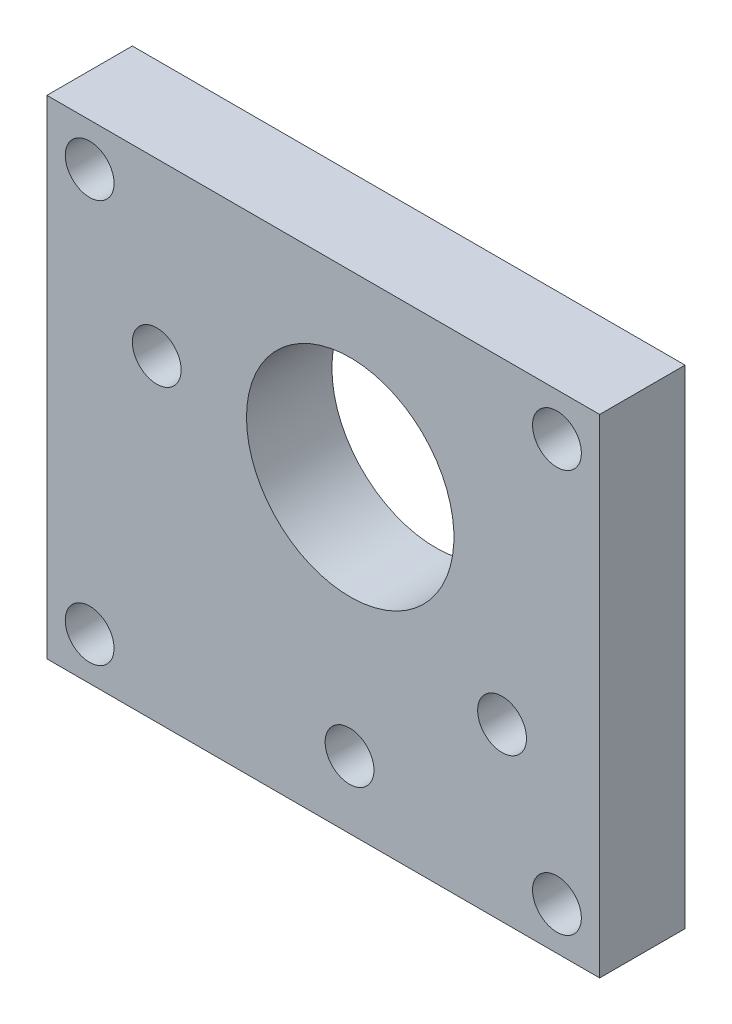
ISO-10303-21;
HEADER;
FILE_DESCRIPTION(('STEP AP214'),'2;1');
FILE_NAME('part.step','',(''),(''),'','','');
FILE_SCHEMA(('AUTOMOTIVE_DESIGN { 1 0 10303 214 1 1 1 1 }'));
ENDSEC;
DATA;
#1=APPLICATION_CONTEXT('core data for automotive mechanical design processes');
#2=APPLICATION_PROTOCOL_DEFINITION('international standard','automotive_design',2000,#1);
#3=PRODUCT_CONTEXT('',#1,'mechanical');
#4=PRODUCT('Part','Part','',(#3));
#5=PRODUCT_RELATED_PRODUCT_CATEGORY('part','',(#4));
#6=PRODUCT_DEFINITION_FORMATION('','',#4);
#7=PRODUCT_DEFINITION_CONTEXT('part definition',#1,'design');
#8=PRODUCT_DEFINITION('design','',#6,#7);
#9=PRODUCT_DEFINITION_SHAPE('','',#8);
#10=(LENGTH_UNIT() NAMED_UNIT(*) SI_UNIT(.MILLI.,.METRE.));
#11=(NAMED_UNIT(*) PLANE_ANGLE_UNIT() SI_UNIT($,.RADIAN.));
#12=(NAMED_UNIT(*) SI_UNIT($,.STERADIAN.) SOLID_ANGLE_UNIT());
#13=UNCERTAINTY_MEASURE_WITH_UNIT(LENGTH_MEASURE(1.E-05),#10,'distance_accuracy_value','');
#14=(GEOMETRIC_REPRESENTATION_CONTEXT(3) GLOBAL_UNCERTAINTY_ASSIGNED_CONTEXT((#13)) GLOBAL_UNIT_ASSIGNED_CONTEXT((#10,
#11,#12)) REPRESENTATION_CONTEXT('',''));
#15=CARTESIAN_POINT('',(0.,0.,0.));
#16=DIRECTION('',(0.,0.,1.));
#17=DIRECTION('',(1.,0.,0.));
#18=AXIS2_PLACEMENT_3D('',#15,#16,#17);
#19=CARTESIAN_POINT('',(-19.1726141078838,20.5454356846473,-7.));
#20=DIRECTION('',(-1.,0.,0.));
#21=DIRECTION('',(0.,-1.,0.));
#22=AXIS2_PLACEMENT_3D('',#19,#20,#21);
#23=PLANE('',#22);
#24=DIRECTION('',(0.,-1.,0.));
#25=VECTOR('',#24,1.);
#26=CARTESIAN_POINT('',(-19.1726141078838,20.5454356846473,0.));
#27=LINE('',#26,#25);
#28=CARTESIAN_POINT('',(-19.1726141078838,20.5454356846473,0.));
#29=VERTEX_POINT('',#28);
#30=CARTESIAN_POINT('',(-19.1726141078838,-19.4545643153527,0.));
#31=VERTEX_POINT('',#30);
#32=EDGE_CURVE('E98',#29,#31,#27,.T.);
#33=ORIENTED_EDGE('',*,*,#32,.F.);
#34=DIRECTION('',(0.,0.,1.));
#35=VECTOR('',#34,1.);
#36=CARTESIAN_POINT('',(-19.1726141078838,20.5454356846473,-7.));
#37=LINE('',#36,#35);
#38=CARTESIAN_POINT('',(-19.1726141078838,20.5454356846473,-7.));
#39=VERTEX_POINT('',#38);
#40=EDGE_CURVE('E11',#39,#29,#37,.T.);
#41=ORIENTED_EDGE('',*,*,#40,.F.);
#42=DIRECTION('',(0.,-1.,0.));
#43=VECTOR('',#42,1.);
#44=CARTESIAN_POINT('',(-19.1726141078838,20.5454356846473,-7.));
#45=LINE('',#44,#43);
#46=CARTESIAN_POINT('',(-19.1726141078838,-19.4545643153527,-7.));
#47=VERTEX_POINT('',#46);
#48=EDGE_CURVE('E91',#39,#47,#45,.T.);
#49=ORIENTED_EDGE('',*,*,#48,.T.);
#50=DIRECTION('',(0.,0.,1.));
#51=VECTOR('',#50,1.);
#52=CARTESIAN_POINT('',(-19.1726141078838,-19.4545643153527,-7.));
#53=LINE('',#52,#51);
#54=EDGE_CURVE('E36',#47,#31,#53,.T.);
#55=ORIENTED_EDGE('',*,*,#54,.T.);
#56=EDGE_LOOP('',(#33,#41,#49,#55));
#57=FACE_BOUND('',#56,.T.);
#58=ADVANCED_FACE('F33',(#57),#23,.T.);
#59=CARTESIAN_POINT('',(-19.1726141078838,20.5454356846473,-7.));
#60=DIRECTION('',(0.,1.,0.));
#61=DIRECTION('',(0.,0.,1.));
#62=AXIS2_PLACEMENT_3D('',#59,#60,#61);
#63=PLANE('',#62);
#64=DIRECTION('',(-1.,0.,0.));
#65=VECTOR('',#64,1.);
#66=CARTESIAN_POINT('',(-19.1726141078838,20.5454356846473,0.));
#67=LINE('',#66,#65);
#68=CARTESIAN_POINT('',(26.1273858921162,20.5454356846473,0.));
#69=VERTEX_POINT('',#68);
#70=EDGE_CURVE('E93',#69,#29,#67,.T.);
#71=ORIENTED_EDGE('',*,*,#70,.F.);
#72=DIRECTION('',(0.,0.,1.));
#73=VECTOR('',#72,1.);
#74=CARTESIAN_POINT('',(26.1273858921162,20.5454356846473,-7.));
#75=LINE('',#74,#73);
#76=CARTESIAN_POINT('',(26.1273858921162,20.5454356846473,-7.));
#77=VERTEX_POINT('',#76);
#78=EDGE_CURVE('E42',#77,#69,#75,.T.);
#79=ORIENTED_EDGE('',*,*,#78,.F.);
#80=DIRECTION('',(-1.,0.,0.));
#81=VECTOR('',#80,1.);
#82=CARTESIAN_POINT('',(-19.1726141078838,20.5454356846473,-7.));
#83=LINE('',#82,#81);
#84=EDGE_CURVE('E88',#77,#39,#83,.T.);
#85=ORIENTED_EDGE('',*,*,#84,.T.);
#86=ORIENTED_EDGE('',*,*,#40,.T.);
#87=EDGE_LOOP('',(#71,#79,#85,#86));
#88=FACE_BOUND('',#87,.T.);
#89=ADVANCED_FACE('F109',(#88),#63,.T.);
#90=CARTESIAN_POINT('',(26.1273858921162,20.5454356846473,-7.));
#91=DIRECTION('',(1.,0.,0.));
#92=DIRECTION('',(0.,1.,0.));
#93=AXIS2_PLACEMENT_3D('',#90,#91,#92);
#94=PLANE('',#93);
#95=DIRECTION('',(0.,1.,0.));
#96=VECTOR('',#95,1.);
#97=CARTESIAN_POINT('',(26.1273858921162,20.5454356846473,0.));
#98=LINE('',#97,#96);
#99=CARTESIAN_POINT('',(26.1273858921162,-19.4545643153527,0.));
#100=VERTEX_POINT('',#99);
#101=EDGE_CURVE('E83',#100,#69,#98,.T.);
#102=ORIENTED_EDGE('',*,*,#101,.F.);
#103=DIRECTION('',(0.,0.,1.));
#104=VECTOR('',#103,1.);
#105=CARTESIAN_POINT('',(26.1273858921162,-19.4545643153527,-7.));
#106=LINE('',#105,#104);
#107=CARTESIAN_POINT('',(26.1273858921162,-19.4545643153527,-7.));
#108=VERTEX_POINT('',#107);
#109=EDGE_CURVE('E78',#108,#100,#106,.T.);
#110=ORIENTED_EDGE('',*,*,#109,.F.);
#111=DIRECTION('',(0.,1.,0.));
#112=VECTOR('',#111,1.);
#113=CARTESIAN_POINT('',(26.1273858921162,20.5454356846473,-7.));
#114=LINE('',#113,#112);
#115=EDGE_CURVE('E81',#108,#77,#114,.T.);
#116=ORIENTED_EDGE('',*,*,#115,.T.);
#117=ORIENTED_EDGE('',*,*,#78,.T.);
#118=EDGE_LOOP('',(#102,#110,#116,#117));
#119=FACE_BOUND('',#118,.T.);
#120=ADVANCED_FACE('F80',(#119),#94,.T.);
#121=CARTESIAN_POINT('',(-19.1726141078838,-19.4545643153527,-7.));
#122=DIRECTION('',(0.,-1.,0.));
#123=DIRECTION('',(0.,0.,-1.));
#124=AXIS2_PLACEMENT_3D('',#121,#122,#123);
#125=PLANE('',#124);
#126=DIRECTION('',(1.,0.,0.));
#127=VECTOR('',#126,1.);
#128=CARTESIAN_POINT('',(-19.1726141078838,-19.4545643153527,0.));
#129=LINE('',#128,#127);
#130=EDGE_CURVE('E101',#31,#100,#129,.T.);
#131=ORIENTED_EDGE('',*,*,#130,.F.);
#132=ORIENTED_EDGE('',*,*,#54,.F.);
#133=DIRECTION('',(1.,0.,0.));
#134=VECTOR('',#133,1.);
#135=CARTESIAN_POINT('',(-19.1726141078838,-19.4545643153527,-7.));
#136=LINE('',#135,#134);
#137=EDGE_CURVE('E87',#47,#108,#136,.T.);
#138=ORIENTED_EDGE('',*,*,#137,.T.);
#139=ORIENTED_EDGE('',*,*,#109,.T.);
#140=EDGE_LOOP('',(#131,#132,#138,#139));
#141=FACE_BOUND('',#140,.T.);
#142=ADVANCED_FACE('F90',(#141),#125,.T.);
#143=CARTESIAN_POINT('',(0.,0.,-7.));
#144=DIRECTION('',(0.,0.,1.));
#145=DIRECTION('',(1.,0.,0.));
#146=AXIS2_PLACEMENT_3D('',#143,#144,#145);
#147=PLANE('',#146);
#148=CARTESIAN_POINT('',(5.62738589211616,-13.9545643153527,-7.));
#149=DIRECTION('',(0.,0.,-1.));
#150=DIRECTION('',(-1.,0.,0.));
#151=AXIS2_PLACEMENT_3D('',#148,#149,#150);
#152=CIRCLE('',#151,3.);
#153=CARTESIAN_POINT('',(2.62738589211617,-13.9545643153527,-7.));
#154=VERTEX_POINT('',#153);
#155=EDGE_CURVE('E225',#154,#154,#152,.T.);
#156=ORIENTED_EDGE('',*,*,#155,.F.);
#157=EDGE_LOOP('',(#156));
#158=FACE_BOUND('',#157,.T.);
#159=CARTESIAN_POINT('',(18.1273858921162,-5.4545643153527,-7.));
#160=DIRECTION('',(0.,0.,-1.));
#161=DIRECTION('',(-1.,0.,0.));
#162=AXIS2_PLACEMENT_3D('',#159,#160,#161);
#163=CIRCLE('',#162,3.);
#164=CARTESIAN_POINT('',(15.1273858921162,-5.4545643153527,-7.));
#165=VERTEX_POINT('',#164);
#166=EDGE_CURVE('E235',#165,#165,#163,.T.);
#167=ORIENTED_EDGE('',*,*,#166,.F.);
#168=EDGE_LOOP('',(#167));
#169=FACE_BOUND('',#168,.T.);
#170=CARTESIAN_POINT('',(-10.1726141078838,6.5454356846473,-7.));
#171=DIRECTION('',(0.,0.,-1.));
#172=DIRECTION('',(-1.,0.,0.));
#173=AXIS2_PLACEMENT_3D('',#170,#171,#172);
#174=CIRCLE('',#173,3.);
#175=CARTESIAN_POINT('',(-13.1726141078838,6.5454356846473,-7.));
#176=VERTEX_POINT('',#175);
#177=EDGE_CURVE('E247',#176,#176,#174,.T.);
#178=ORIENTED_EDGE('',*,*,#177,.F.);
#179=EDGE_LOOP('',(#178));
#180=FACE_BOUND('',#179,.T.);
#181=CARTESIAN_POINT('',(5.68295862486169,5.86637990239594,-7.));
#182=DIRECTION('',(0.,0.,-1.));
#183=DIRECTION('',(-1.,0.,0.));
#184=AXIS2_PLACEMENT_3D('',#181,#182,#183);
#185=CIRCLE('',#184,8.5);
#186=CARTESIAN_POINT('',(-2.81704137513832,5.86637990239594,-7.));
#187=VERTEX_POINT('',#186);
#188=EDGE_CURVE('E259',#187,#187,#185,.T.);
#189=ORIENTED_EDGE('',*,*,#188,.F.);
#190=EDGE_LOOP('',(#189));
#191=FACE_BOUND('',#190,.T.);
#192=CARTESIAN_POINT('',(22.6273858921162,17.0454356846473,-7.));
#193=DIRECTION('',(0.,0.,-1.));
#194=DIRECTION('',(-1.,0.,0.));
#195=AXIS2_PLACEMENT_3D('',#192,#193,#194);
#196=CIRCLE('',#195,3.);
#197=CARTESIAN_POINT('',(19.6273858921162,17.0454356846473,-7.));
#198=VERTEX_POINT('',#197);
#199=EDGE_CURVE('E263',#198,#198,#196,.T.);
#200=ORIENTED_EDGE('',*,*,#199,.F.);
#201=EDGE_LOOP('',(#200));
#202=FACE_BOUND('',#201,.T.);
#203=CARTESIAN_POINT('',(-15.6726141078838,17.0454356846473,-7.));
#204=DIRECTION('',(0.,0.,-1.));
#205=DIRECTION('',(-1.,0.,0.));
#206=AXIS2_PLACEMENT_3D('',#203,#204,#205);
#207=CIRCLE('',#206,3.);
#208=CARTESIAN_POINT('',(-18.6726141078838,17.0454356846473,-7.));
#209=VERTEX_POINT('',#208);
#210=EDGE_CURVE('E277',#209,#209,#207,.T.);
#211=ORIENTED_EDGE('',*,*,#210,.F.);
#212=EDGE_LOOP('',(#211));
#213=FACE_BOUND('',#212,.T.);
#214=CARTESIAN_POINT('',(-15.6726141078838,-15.9545643153527,-7.));
#215=DIRECTION('',(0.,0.,-1.));
#216=DIRECTION('',(-1.,0.,0.));
#217=AXIS2_PLACEMENT_3D('',#214,#215,#216);
#218=CIRCLE('',#217,3.);
#219=CARTESIAN_POINT('',(-18.6726141078838,-15.9545643153527,-7.));
#220=VERTEX_POINT('',#219);
#221=EDGE_CURVE('E289',#220,#220,#218,.T.);
#222=ORIENTED_EDGE('',*,*,#221,.F.);
#223=EDGE_LOOP('',(#222));
#224=FACE_BOUND('',#223,.T.);
#225=CARTESIAN_POINT('',(22.6273858921162,-15.9545643153527,-7.));
#226=DIRECTION('',(0.,0.,-1.));
#227=DIRECTION('',(-1.,0.,0.));
#228=AXIS2_PLACEMENT_3D('',#225,#226,#227);
#229=CIRCLE('',#228,3.);
#230=CARTESIAN_POINT('',(19.6273858921162,-15.9545643153527,-7.));
#231=VERTEX_POINT('',#230);
#232=EDGE_CURVE('E301',#231,#231,#229,.T.);
#233=ORIENTED_EDGE('',*,*,#232,.F.);
#234=EDGE_LOOP('',(#233));
#235=FACE_BOUND('',#234,.T.);
#236=ORIENTED_EDGE('',*,*,#48,.F.);
#237=ORIENTED_EDGE('',*,*,#84,.F.);
#238=ORIENTED_EDGE('',*,*,#115,.F.);
#239=ORIENTED_EDGE('',*,*,#137,.F.);
#240=EDGE_LOOP('',(#236,#237,#238,#239));
#241=FACE_BOUND('',#240,.T.);
#242=ADVANCED_FACE('F86',(#158,#169,#180,#191,#202,#213,#224,#235,#241),#147,.F.);
#243=CARTESIAN_POINT('',(0.,0.,0.));
#244=DIRECTION('',(0.,0.,1.));
#245=DIRECTION('',(1.,0.,0.));
#246=AXIS2_PLACEMENT_3D('',#243,#244,#245);
#247=PLANE('',#246);
#248=CARTESIAN_POINT('',(5.62738589211616,-13.9545643153527,0.));
#249=DIRECTION('',(0.,0.,1.));
#250=DIRECTION('',(1.,0.,0.));
#251=AXIS2_PLACEMENT_3D('',#248,#249,#250);
#252=CIRCLE('',#251,2.);
#253=CARTESIAN_POINT('',(7.62738589211616,-13.9545643153527,0.));
#254=VERTEX_POINT('',#253);
#255=EDGE_CURVE('E232',#254,#254,#252,.T.);
#256=ORIENTED_EDGE('',*,*,#255,.F.);
#257=EDGE_LOOP('',(#256));
#258=FACE_BOUND('',#257,.T.);
#259=CARTESIAN_POINT('',(18.1273858921162,-5.4545643153527,0.));
#260=DIRECTION('',(0.,0.,1.));
#261=DIRECTION('',(1.,0.,0.));
#262=AXIS2_PLACEMENT_3D('',#259,#260,#261);
#263=CIRCLE('',#262,2.);
#264=CARTESIAN_POINT('',(20.1273858921162,-5.4545643153527,0.));
#265=VERTEX_POINT('',#264);
#266=EDGE_CURVE('E244',#265,#265,#263,.T.);
#267=ORIENTED_EDGE('',*,*,#266,.F.);
#268=EDGE_LOOP('',(#267));
#269=FACE_BOUND('',#268,.T.);
#270=CARTESIAN_POINT('',(-10.1726141078838,6.5454356846473,0.));
#271=DIRECTION('',(0.,0.,1.));
#272=DIRECTION('',(1.,0.,0.));
#273=AXIS2_PLACEMENT_3D('',#270,#271,#272);
#274=CIRCLE('',#273,2.);
#275=CARTESIAN_POINT('',(-8.17261410788384,6.5454356846473,0.));
#276=VERTEX_POINT('',#275);
#277=EDGE_CURVE('E256',#276,#276,#274,.T.);
#278=ORIENTED_EDGE('',*,*,#277,.F.);
#279=EDGE_LOOP('',(#278));
#280=FACE_BOUND('',#279,.T.);
#281=CARTESIAN_POINT('',(5.68295862486169,5.86637990239594,0.));
#282=DIRECTION('',(0.,0.,-1.));
#283=DIRECTION('',(-1.,0.,0.));
#284=AXIS2_PLACEMENT_3D('',#281,#282,#283);
#285=CIRCLE('',#284,8.5);
#286=CARTESIAN_POINT('',(-2.81704137513832,5.86637990239594,0.));
#287=VERTEX_POINT('',#286);
#288=EDGE_CURVE('E260',#287,#287,#285,.T.);
#289=ORIENTED_EDGE('',*,*,#288,.T.);
#290=EDGE_LOOP('',(#289));
#291=FACE_BOUND('',#290,.T.);
#292=CARTESIAN_POINT('',(22.6273858921162,17.0454356846473,0.));
#293=DIRECTION('',(0.,0.,1.));
#294=DIRECTION('',(1.,0.,0.));
#295=AXIS2_PLACEMENT_3D('',#292,#293,#294);
#296=CIRCLE('',#295,2.);
#297=CARTESIAN_POINT('',(24.6273858921162,17.0454356846473,0.));
#298=VERTEX_POINT('',#297);
#299=EDGE_CURVE('E274',#298,#298,#296,.T.);
#300=ORIENTED_EDGE('',*,*,#299,.F.);
#301=EDGE_LOOP('',(#300));
#302=FACE_BOUND('',#301,.T.);
#303=CARTESIAN_POINT('',(-15.6726141078838,17.0454356846473,0.));
#304=DIRECTION('',(0.,0.,1.));
#305=DIRECTION('',(1.,0.,0.));
#306=AXIS2_PLACEMENT_3D('',#303,#304,#305);
#307=CIRCLE('',#306,2.);
#308=CARTESIAN_POINT('',(-13.6726141078838,17.0454356846473,0.));
#309=VERTEX_POINT('',#308);
#310=EDGE_CURVE('E286',#309,#309,#307,.T.);
#311=ORIENTED_EDGE('',*,*,#310,.F.);
#312=EDGE_LOOP('',(#311));
#313=FACE_BOUND('',#312,.T.);
#314=CARTESIAN_POINT('',(-15.6726141078838,-15.9545643153527,0.));
#315=DIRECTION('',(0.,0.,1.));
#316=DIRECTION('',(1.,0.,0.));
#317=AXIS2_PLACEMENT_3D('',#314,#315,#316);
#318=CIRCLE('',#317,2.);
#319=CARTESIAN_POINT('',(-13.6726141078838,-15.9545643153527,0.));
#320=VERTEX_POINT('',#319);
#321=EDGE_CURVE('E298',#320,#320,#318,.T.);
#322=ORIENTED_EDGE('',*,*,#321,.F.);
#323=EDGE_LOOP('',(#322));
#324=FACE_BOUND('',#323,.T.);
#325=CARTESIAN_POINT('',(22.6273858921162,-15.9545643153527,0.));
#326=DIRECTION('',(0.,0.,1.));
#327=DIRECTION('',(1.,0.,0.));
#328=AXIS2_PLACEMENT_3D('',#325,#326,#327);
#329=CIRCLE('',#328,2.);
#330=CARTESIAN_POINT('',(24.6273858921162,-15.9545643153527,0.));
#331=VERTEX_POINT('',#330);
#332=EDGE_CURVE('E102',#331,#331,#329,.T.);
#333=ORIENTED_EDGE('',*,*,#332,.F.);
#334=EDGE_LOOP('',(#333));
#335=FACE_BOUND('',#334,.T.);
#336=ORIENTED_EDGE('',*,*,#32,.T.);
#337=ORIENTED_EDGE('',*,*,#130,.T.);
#338=ORIENTED_EDGE('',*,*,#101,.T.);
#339=ORIENTED_EDGE('',*,*,#70,.T.);
#340=EDGE_LOOP('',(#336,#337,#338,#339));
#341=FACE_BOUND('',#340,.T.);
#342=ADVANCED_FACE('F108',(#258,#269,#280,#291,#302,#313,#324,#335,#341),#247,.T.);
#343=CARTESIAN_POINT('',(22.6273858921162,-15.9545643153527,-7.));
#344=DIRECTION('',(0.,0.,-1.));
#345=DIRECTION('',(-1.,0.,0.));
#346=AXIS2_PLACEMENT_3D('',#343,#344,#345);
#347=CYLINDRICAL_SURFACE('',#346,2.);
#348=CARTESIAN_POINT('',(22.6273858921162,-15.9545643153527,-4.));
#349=DIRECTION('',(0.,0.,-1.));
#350=DIRECTION('',(-1.,0.,0.));
#351=AXIS2_PLACEMENT_3D('',#348,#349,#350);
#352=CIRCLE('',#351,2.);
#353=CARTESIAN_POINT('',(20.6273858921162,-15.9545643153527,-4.));
#354=VERTEX_POINT('',#353);
#355=EDGE_CURVE('E307',#354,#354,#352,.T.);
#356=ORIENTED_EDGE('',*,*,#355,.T.);
#357=EDGE_LOOP('',(#356));
#358=FACE_BOUND('',#357,.T.);
#359=ORIENTED_EDGE('',*,*,#332,.T.);
#360=EDGE_LOOP('',(#359));
#361=FACE_BOUND('',#360,.T.);
#362=ADVANCED_FACE('F127',(#358,#361),#347,.F.);
#363=CARTESIAN_POINT('',(24.6273858921162,-15.9545643153527,-4.));
#364=DIRECTION('',(0.,0.,1.));
#365=DIRECTION('',(1.,0.,0.));
#366=AXIS2_PLACEMENT_3D('',#363,#364,#365);
#367=PLANE('',#366);
#368=ORIENTED_EDGE('',*,*,#355,.F.);
#369=EDGE_LOOP('',(#368));
#370=FACE_BOUND('',#369,.T.);
#371=CARTESIAN_POINT('',(22.6273858921162,-15.9545643153527,-4.));
#372=DIRECTION('',(0.,0.,-1.));
#373=DIRECTION('',(-1.,0.,0.));
#374=AXIS2_PLACEMENT_3D('',#371,#372,#373);
#375=CIRCLE('',#374,3.);
#376=CARTESIAN_POINT('',(19.6273858921162,-15.9545643153527,-4.));
#377=VERTEX_POINT('',#376);
#378=EDGE_CURVE('E304',#377,#377,#375,.T.);
#379=ORIENTED_EDGE('',*,*,#378,.T.);
#380=EDGE_LOOP('',(#379));
#381=FACE_BOUND('',#380,.T.);
#382=ADVANCED_FACE('F134',(#370,#381),#367,.F.);
#383=CARTESIAN_POINT('',(22.6273858921162,-15.9545643153527,-7.));
#384=DIRECTION('',(0.,0.,-1.));
#385=DIRECTION('',(-1.,0.,0.));
#386=AXIS2_PLACEMENT_3D('',#383,#384,#385);
#387=CYLINDRICAL_SURFACE('',#386,3.);
#388=ORIENTED_EDGE('',*,*,#378,.F.);
#389=EDGE_LOOP('',(#388));
#390=FACE_BOUND('',#389,.T.);
#391=ORIENTED_EDGE('',*,*,#232,.T.);
#392=EDGE_LOOP('',(#391));
#393=FACE_BOUND('',#392,.T.);
#394=ADVANCED_FACE('F138',(#390,#393),#387,.F.);
#395=CARTESIAN_POINT('',(-15.6726141078838,-15.9545643153527,-7.));
#396=DIRECTION('',(0.,0.,-1.));
#397=DIRECTION('',(-1.,0.,0.));
#398=AXIS2_PLACEMENT_3D('',#395,#396,#397);
#399=CYLINDRICAL_SURFACE('',#398,2.);
#400=CARTESIAN_POINT('',(-15.6726141078838,-15.9545643153527,-4.));
#401=DIRECTION('',(0.,0.,-1.));
#402=DIRECTION('',(-1.,0.,0.));
#403=AXIS2_PLACEMENT_3D('',#400,#401,#402);
#404=CIRCLE('',#403,2.);
#405=CARTESIAN_POINT('',(-17.6726141078838,-15.9545643153527,-4.));
#406=VERTEX_POINT('',#405);
#407=EDGE_CURVE('E295',#406,#406,#404,.T.);
#408=ORIENTED_EDGE('',*,*,#407,.T.);
#409=EDGE_LOOP('',(#408));
#410=FACE_BOUND('',#409,.T.);
#411=ORIENTED_EDGE('',*,*,#321,.T.);
#412=EDGE_LOOP('',(#411));
#413=FACE_BOUND('',#412,.T.);
#414=ADVANCED_FACE('F142',(#410,#413),#399,.F.);
#415=CARTESIAN_POINT('',(-13.6726141078838,-15.9545643153527,-4.));
#416=DIRECTION('',(0.,0.,1.));
#417=DIRECTION('',(1.,0.,0.));
#418=AXIS2_PLACEMENT_3D('',#415,#416,#417);
#419=PLANE('',#418);
#420=ORIENTED_EDGE('',*,*,#407,.F.);
#421=EDGE_LOOP('',(#420));
#422=FACE_BOUND('',#421,.T.);
#423=CARTESIAN_POINT('',(-15.6726141078838,-15.9545643153527,-4.));
#424=DIRECTION('',(0.,0.,-1.));
#425=DIRECTION('',(-1.,0.,0.));
#426=AXIS2_PLACEMENT_3D('',#423,#424,#425);
#427=CIRCLE('',#426,3.);
#428=CARTESIAN_POINT('',(-18.6726141078838,-15.9545643153527,-4.));
#429=VERTEX_POINT('',#428);
#430=EDGE_CURVE('E292',#429,#429,#427,.T.);
#431=ORIENTED_EDGE('',*,*,#430,.T.);
#432=EDGE_LOOP('',(#431));
#433=FACE_BOUND('',#432,.T.);
#434=ADVANCED_FACE('F146',(#422,#433),#419,.F.);
#435=CARTESIAN_POINT('',(-15.6726141078838,-15.9545643153527,-7.));
#436=DIRECTION('',(0.,0.,-1.));
#437=DIRECTION('',(-1.,0.,0.));
#438=AXIS2_PLACEMENT_3D('',#435,#436,#437);
#439=CYLINDRICAL_SURFACE('',#438,3.);
#440=ORIENTED_EDGE('',*,*,#430,.F.);
#441=EDGE_LOOP('',(#440));
#442=FACE_BOUND('',#441,.T.);
#443=ORIENTED_EDGE('',*,*,#221,.T.);
#444=EDGE_LOOP('',(#443));
#445=FACE_BOUND('',#444,.T.);
#446=ADVANCED_FACE('F150',(#442,#445),#439,.F.);
#447=CARTESIAN_POINT('',(-15.6726141078838,17.0454356846473,-7.));
#448=DIRECTION('',(0.,0.,-1.));
#449=DIRECTION('',(-1.,0.,0.));
#450=AXIS2_PLACEMENT_3D('',#447,#448,#449);
#451=CYLINDRICAL_SURFACE('',#450,2.);
#452=CARTESIAN_POINT('',(-15.6726141078838,17.0454356846473,-4.));
#453=DIRECTION('',(0.,0.,-1.));
#454=DIRECTION('',(-1.,0.,0.));
#455=AXIS2_PLACEMENT_3D('',#452,#453,#454);
#456=CIRCLE('',#455,2.);
#457=CARTESIAN_POINT('',(-17.6726141078838,17.0454356846473,-4.));
#458=VERTEX_POINT('',#457);
#459=EDGE_CURVE('E283',#458,#458,#456,.T.);
#460=ORIENTED_EDGE('',*,*,#459,.T.);
#461=EDGE_LOOP('',(#460));
#462=FACE_BOUND('',#461,.T.);
#463=ORIENTED_EDGE('',*,*,#310,.T.);
#464=EDGE_LOOP('',(#463));
#465=FACE_BOUND('',#464,.T.);
#466=ADVANCED_FACE('F154',(#462,#465),#451,.F.);
#467=CARTESIAN_POINT('',(-13.6726141078838,17.0454356846473,-4.));
#468=DIRECTION('',(0.,0.,1.));
#469=DIRECTION('',(1.,0.,0.));
#470=AXIS2_PLACEMENT_3D('',#467,#468,#469);
#471=PLANE('',#470);
#472=ORIENTED_EDGE('',*,*,#459,.F.);
#473=EDGE_LOOP('',(#472));
#474=FACE_BOUND('',#473,.T.);
#475=CARTESIAN_POINT('',(-15.6726141078838,17.0454356846473,-4.));
#476=DIRECTION('',(0.,0.,-1.));
#477=DIRECTION('',(-1.,0.,0.));
#478=AXIS2_PLACEMENT_3D('',#475,#476,#477);
#479=CIRCLE('',#478,3.);
#480=CARTESIAN_POINT('',(-18.6726141078838,17.0454356846473,-4.));
#481=VERTEX_POINT('',#480);
#482=EDGE_CURVE('E280',#481,#481,#479,.T.);
#483=ORIENTED_EDGE('',*,*,#482,.T.);
#484=EDGE_LOOP('',(#483));
#485=FACE_BOUND('',#484,.T.);
#486=ADVANCED_FACE('F158',(#474,#485),#471,.F.);
#487=CARTESIAN_POINT('',(-15.6726141078838,17.0454356846473,-7.));
#488=DIRECTION('',(0.,0.,-1.));
#489=DIRECTION('',(-1.,0.,0.));
#490=AXIS2_PLACEMENT_3D('',#487,#488,#489);
#491=CYLINDRICAL_SURFACE('',#490,3.);
#492=ORIENTED_EDGE('',*,*,#482,.F.);
#493=EDGE_LOOP('',(#492));
#494=FACE_BOUND('',#493,.T.);
#495=ORIENTED_EDGE('',*,*,#210,.T.);
#496=EDGE_LOOP('',(#495));
#497=FACE_BOUND('',#496,.T.);
#498=ADVANCED_FACE('F162',(#494,#497),#491,.F.);
#499=CARTESIAN_POINT('',(22.6273858921162,17.0454356846473,-7.));
#500=DIRECTION('',(0.,0.,-1.));
#501=DIRECTION('',(-1.,0.,0.));
#502=AXIS2_PLACEMENT_3D('',#499,#500,#501);
#503=CYLINDRICAL_SURFACE('',#502,2.);
#504=CARTESIAN_POINT('',(22.6273858921162,17.0454356846473,-4.));
#505=DIRECTION('',(0.,0.,-1.));
#506=DIRECTION('',(-1.,0.,0.));
#507=AXIS2_PLACEMENT_3D('',#504,#505,#506);
#508=CIRCLE('',#507,2.);
#509=CARTESIAN_POINT('',(20.6273858921162,17.0454356846473,-4.));
#510=VERTEX_POINT('',#509);
#511=EDGE_CURVE('E271',#510,#510,#508,.T.);
#512=ORIENTED_EDGE('',*,*,#511,.T.);
#513=EDGE_LOOP('',(#512));
#514=FACE_BOUND('',#513,.T.);
#515=ORIENTED_EDGE('',*,*,#299,.T.);
#516=EDGE_LOOP('',(#515));
#517=FACE_BOUND('',#516,.T.);
#518=ADVANCED_FACE('F166',(#514,#517),#503,.F.);
#519=CARTESIAN_POINT('',(24.6273858921162,17.0454356846473,-4.));
#520=DIRECTION('',(0.,0.,1.));
#521=DIRECTION('',(1.,0.,0.));
#522=AXIS2_PLACEMENT_3D('',#519,#520,#521);
#523=PLANE('',#522);
#524=ORIENTED_EDGE('',*,*,#511,.F.);
#525=EDGE_LOOP('',(#524));
#526=FACE_BOUND('',#525,.T.);
#527=CARTESIAN_POINT('',(22.6273858921162,17.0454356846473,-4.));
#528=DIRECTION('',(0.,0.,-1.));
#529=DIRECTION('',(-1.,0.,0.));
#530=AXIS2_PLACEMENT_3D('',#527,#528,#529);
#531=CIRCLE('',#530,3.);
#532=CARTESIAN_POINT('',(19.6273858921162,17.0454356846473,-4.));
#533=VERTEX_POINT('',#532);
#534=EDGE_CURVE('E268',#533,#533,#531,.T.);
#535=ORIENTED_EDGE('',*,*,#534,.T.);
#536=EDGE_LOOP('',(#535));
#537=FACE_BOUND('',#536,.T.);
#538=ADVANCED_FACE('F170',(#526,#537),#523,.F.);
#539=CARTESIAN_POINT('',(22.6273858921162,17.0454356846473,-7.));
#540=DIRECTION('',(0.,0.,-1.));
#541=DIRECTION('',(-1.,0.,0.));
#542=AXIS2_PLACEMENT_3D('',#539,#540,#541);
#543=CYLINDRICAL_SURFACE('',#542,3.);
#544=ORIENTED_EDGE('',*,*,#534,.F.);
#545=EDGE_LOOP('',(#544));
#546=FACE_BOUND('',#545,.T.);
#547=ORIENTED_EDGE('',*,*,#199,.T.);
#548=EDGE_LOOP('',(#547));
#549=FACE_BOUND('',#548,.T.);
#550=ADVANCED_FACE('F174',(#546,#549),#543,.F.);
#551=CARTESIAN_POINT('',(5.68295862486169,5.86637990239594,0.));
#552=DIRECTION('',(0.,0.,-1.));
#553=DIRECTION('',(-1.,0.,0.));
#554=AXIS2_PLACEMENT_3D('',#551,#552,#553);
#555=CYLINDRICAL_SURFACE('',#554,8.5);
#556=ORIENTED_EDGE('',*,*,#288,.F.);
#557=EDGE_LOOP('',(#556));
#558=FACE_BOUND('',#557,.T.);
#559=ORIENTED_EDGE('',*,*,#188,.T.);
#560=EDGE_LOOP('',(#559));
#561=FACE_BOUND('',#560,.T.);
#562=ADVANCED_FACE('F178',(#558,#561),#555,.F.);
#563=CARTESIAN_POINT('',(-10.1726141078838,6.5454356846473,-7.));
#564=DIRECTION('',(0.,0.,-1.));
#565=DIRECTION('',(-1.,0.,0.));
#566=AXIS2_PLACEMENT_3D('',#563,#564,#565);
#567=CYLINDRICAL_SURFACE('',#566,2.);
#568=CARTESIAN_POINT('',(-10.1726141078838,6.5454356846473,-4.));
#569=DIRECTION('',(0.,0.,-1.));
#570=DIRECTION('',(-1.,0.,0.));
#571=AXIS2_PLACEMENT_3D('',#568,#569,#570);
#572=CIRCLE('',#571,2.);
#573=CARTESIAN_POINT('',(-12.1726141078838,6.5454356846473,-4.));
#574=VERTEX_POINT('',#573);
#575=EDGE_CURVE('E253',#574,#574,#572,.T.);
#576=ORIENTED_EDGE('',*,*,#575,.T.);
#577=EDGE_LOOP('',(#576));
#578=FACE_BOUND('',#577,.T.);
#579=ORIENTED_EDGE('',*,*,#277,.T.);
#580=EDGE_LOOP('',(#579));
#581=FACE_BOUND('',#580,.T.);
#582=ADVANCED_FACE('F182',(#578,#581),#567,.F.);
#583=CARTESIAN_POINT('',(-8.17261410788384,6.5454356846473,-4.));
#584=DIRECTION('',(0.,0.,1.));
#585=DIRECTION('',(1.,0.,0.));
#586=AXIS2_PLACEMENT_3D('',#583,#584,#585);
#587=PLANE('',#586);
#588=ORIENTED_EDGE('',*,*,#575,.F.);
#589=EDGE_LOOP('',(#588));
#590=FACE_BOUND('',#589,.T.);
#591=CARTESIAN_POINT('',(-10.1726141078838,6.5454356846473,-4.));
#592=DIRECTION('',(0.,0.,-1.));
#593=DIRECTION('',(-1.,0.,0.));
#594=AXIS2_PLACEMENT_3D('',#591,#592,#593);
#595=CIRCLE('',#594,3.);
#596=CARTESIAN_POINT('',(-13.1726141078838,6.5454356846473,-4.));
#597=VERTEX_POINT('',#596);
#598=EDGE_CURVE('E250',#597,#597,#595,.T.);
#599=ORIENTED_EDGE('',*,*,#598,.T.);
#600=EDGE_LOOP('',(#599));
#601=FACE_BOUND('',#600,.T.);
#602=ADVANCED_FACE('F186',(#590,#601),#587,.F.);
#603=CARTESIAN_POINT('',(-10.1726141078838,6.5454356846473,-7.));
#604=DIRECTION('',(0.,0.,-1.));
#605=DIRECTION('',(-1.,0.,0.));
#606=AXIS2_PLACEMENT_3D('',#603,#604,#605);
#607=CYLINDRICAL_SURFACE('',#606,3.);
#608=ORIENTED_EDGE('',*,*,#598,.F.);
#609=EDGE_LOOP('',(#608));
#610=FACE_BOUND('',#609,.T.);
#611=ORIENTED_EDGE('',*,*,#177,.T.);
#612=EDGE_LOOP('',(#611));
#613=FACE_BOUND('',#612,.T.);
#614=ADVANCED_FACE('F190',(#610,#613),#607,.F.);
#615=CARTESIAN_POINT('',(18.1273858921162,-5.4545643153527,-7.));
#616=DIRECTION('',(0.,0.,-1.));
#617=DIRECTION('',(-1.,0.,0.));
#618=AXIS2_PLACEMENT_3D('',#615,#616,#617);
#619=CYLINDRICAL_SURFACE('',#618,2.);
#620=CARTESIAN_POINT('',(18.1273858921162,-5.4545643153527,-4.));
#621=DIRECTION('',(0.,0.,-1.));
#622=DIRECTION('',(-1.,0.,0.));
#623=AXIS2_PLACEMENT_3D('',#620,#621,#622);
#624=CIRCLE('',#623,2.);
#625=CARTESIAN_POINT('',(16.1273858921162,-5.4545643153527,-4.));
#626=VERTEX_POINT('',#625);
#627=EDGE_CURVE('E241',#626,#626,#624,.T.);
#628=ORIENTED_EDGE('',*,*,#627,.T.);
#629=EDGE_LOOP('',(#628));
#630=FACE_BOUND('',#629,.T.);
#631=ORIENTED_EDGE('',*,*,#266,.T.);
#632=EDGE_LOOP('',(#631));
#633=FACE_BOUND('',#632,.T.);
#634=ADVANCED_FACE('F194',(#630,#633),#619,.F.);
#635=CARTESIAN_POINT('',(20.1273858921162,-5.4545643153527,-4.));
#636=DIRECTION('',(0.,0.,1.));
#637=DIRECTION('',(1.,0.,0.));
#638=AXIS2_PLACEMENT_3D('',#635,#636,#637);
#639=PLANE('',#638);
#640=ORIENTED_EDGE('',*,*,#627,.F.);
#641=EDGE_LOOP('',(#640));
#642=FACE_BOUND('',#641,.T.);
#643=CARTESIAN_POINT('',(18.1273858921162,-5.4545643153527,-4.));
#644=DIRECTION('',(0.,0.,-1.));
#645=DIRECTION('',(-1.,0.,0.));
#646=AXIS2_PLACEMENT_3D('',#643,#644,#645);
#647=CIRCLE('',#646,3.);
#648=CARTESIAN_POINT('',(15.1273858921162,-5.4545643153527,-4.));
#649=VERTEX_POINT('',#648);
#650=EDGE_CURVE('E238',#649,#649,#647,.T.);
#651=ORIENTED_EDGE('',*,*,#650,.T.);
#652=EDGE_LOOP('',(#651));
#653=FACE_BOUND('',#652,.T.);
#654=ADVANCED_FACE('F198',(#642,#653),#639,.F.);
#655=CARTESIAN_POINT('',(18.1273858921162,-5.4545643153527,-7.));
#656=DIRECTION('',(0.,0.,-1.));
#657=DIRECTION('',(-1.,0.,0.));
#658=AXIS2_PLACEMENT_3D('',#655,#656,#657);
#659=CYLINDRICAL_SURFACE('',#658,3.);
#660=ORIENTED_EDGE('',*,*,#650,.F.);
#661=EDGE_LOOP('',(#660));
#662=FACE_BOUND('',#661,.T.);
#663=ORIENTED_EDGE('',*,*,#166,.T.);
#664=EDGE_LOOP('',(#663));
#665=FACE_BOUND('',#664,.T.);
#666=ADVANCED_FACE('F202',(#662,#665),#659,.F.);
#667=CARTESIAN_POINT('',(5.62738589211616,-13.9545643153527,-7.));
#668=DIRECTION('',(0.,0.,-1.));
#669=DIRECTION('',(-1.,0.,0.));
#670=AXIS2_PLACEMENT_3D('',#667,#668,#669);
#671=CYLINDRICAL_SURFACE('',#670,2.);
#672=CARTESIAN_POINT('',(5.62738589211616,-13.9545643153527,-4.));
#673=DIRECTION('',(0.,0.,-1.));
#674=DIRECTION('',(-1.,0.,0.));
#675=AXIS2_PLACEMENT_3D('',#672,#673,#674);
#676=CIRCLE('',#675,2.);
#677=CARTESIAN_POINT('',(3.62738589211617,-13.9545643153527,-4.));
#678=VERTEX_POINT('',#677);
#679=EDGE_CURVE('E227',#678,#678,#676,.T.);
#680=ORIENTED_EDGE('',*,*,#679,.T.);
#681=EDGE_LOOP('',(#680));
#682=FACE_BOUND('',#681,.T.);
#683=ORIENTED_EDGE('',*,*,#255,.T.);
#684=EDGE_LOOP('',(#683));
#685=FACE_BOUND('',#684,.T.);
#686=ADVANCED_FACE('F206',(#682,#685),#671,.F.);
#687=CARTESIAN_POINT('',(7.62738589211616,-13.9545643153527,-4.));
#688=DIRECTION('',(0.,0.,1.));
#689=DIRECTION('',(1.,0.,0.));
#690=AXIS2_PLACEMENT_3D('',#687,#688,#689);
#691=PLANE('',#690);
#692=ORIENTED_EDGE('',*,*,#679,.F.);
#693=EDGE_LOOP('',(#692));
#694=FACE_BOUND('',#693,.T.);
#695=CARTESIAN_POINT('',(5.62738589211616,-13.9545643153527,-4.));
#696=DIRECTION('',(0.,0.,-1.));
#697=DIRECTION('',(-1.,0.,0.));
#698=AXIS2_PLACEMENT_3D('',#695,#696,#697);
#699=CIRCLE('',#698,3.);
#700=CARTESIAN_POINT('',(2.62738589211617,-13.9545643153527,-4.));
#701=VERTEX_POINT('',#700);
#702=EDGE_CURVE('E223',#701,#701,#699,.T.);
#703=ORIENTED_EDGE('',*,*,#702,.T.);
#704=EDGE_LOOP('',(#703));
#705=FACE_BOUND('',#704,.T.);
#706=ADVANCED_FACE('F210',(#694,#705),#691,.F.);
#707=CARTESIAN_POINT('',(5.62738589211616,-13.9545643153527,-7.));
#708=DIRECTION('',(0.,0.,-1.));
#709=DIRECTION('',(-1.,0.,0.));
#710=AXIS2_PLACEMENT_3D('',#707,#708,#709);
#711=CYLINDRICAL_SURFACE('',#710,3.);
#712=ORIENTED_EDGE('',*,*,#702,.F.);
#713=EDGE_LOOP('',(#712));
#714=FACE_BOUND('',#713,.T.);
#715=ORIENTED_EDGE('',*,*,#155,.T.);
#716=EDGE_LOOP('',(#715));
#717=FACE_BOUND('',#716,.T.);
#718=ADVANCED_FACE('F214',(#714,#717),#711,.F.);
#719=CLOSED_SHELL('',(#58,#89,#120,#142,#242,#342,#362,#382,#394,#414,#434,#446,#466,#486,#498,
#518,#538,#550,#562,#582,#602,#614,#634,#654,#666,#686,#706,#718));
#720=MANIFOLD_SOLID_BREP('B2',#719);
#721=ADVANCED_BREP_SHAPE_REPRESENTATION('',(#18,#720),#14);
#722=SHAPE_DEFINITION_REPRESENTATION(#9,#721);
ENDSEC;
END-ISO-10303-21;
